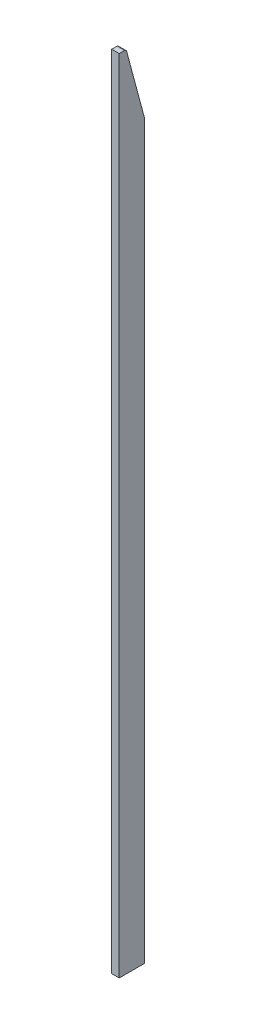
ISO-10303-21;
HEADER;
FILE_DESCRIPTION(('STEP AP214'),'2;1');
FILE_NAME('part.step','',(''),(''),'','','');
FILE_SCHEMA(('AUTOMOTIVE_DESIGN { 1 0 10303 214 1 1 1 1 }'));
ENDSEC;
DATA;
#1=APPLICATION_CONTEXT('core data for automotive mechanical design processes');
#2=APPLICATION_PROTOCOL_DEFINITION('international standard','automotive_design',2000,#1);
#3=PRODUCT_CONTEXT('',#1,'mechanical');
#4=PRODUCT('Part','Part','',(#3));
#5=PRODUCT_RELATED_PRODUCT_CATEGORY('part','',(#4));
#6=PRODUCT_DEFINITION_FORMATION('','',#4);
#7=PRODUCT_DEFINITION_CONTEXT('part definition',#1,'design');
#8=PRODUCT_DEFINITION('design','',#6,#7);
#9=PRODUCT_DEFINITION_SHAPE('','',#8);
#10=(LENGTH_UNIT() NAMED_UNIT(*) SI_UNIT(.MILLI.,.METRE.));
#11=(NAMED_UNIT(*) PLANE_ANGLE_UNIT() SI_UNIT($,.RADIAN.));
#12=(NAMED_UNIT(*) SI_UNIT($,.STERADIAN.) SOLID_ANGLE_UNIT());
#13=UNCERTAINTY_MEASURE_WITH_UNIT(LENGTH_MEASURE(1.E-05),#10,'distance_accuracy_value','');
#14=(GEOMETRIC_REPRESENTATION_CONTEXT(3) GLOBAL_UNCERTAINTY_ASSIGNED_CONTEXT((#13)) GLOBAL_UNIT_ASSIGNED_CONTEXT((#10,
#11,#12)) REPRESENTATION_CONTEXT('',''));
#15=CARTESIAN_POINT('',(0.,0.,0.));
#16=DIRECTION('',(0.,0.,1.));
#17=DIRECTION('',(1.,0.,0.));
#18=AXIS2_PLACEMENT_3D('',#15,#16,#17);
#19=CARTESIAN_POINT('',(9.525,0.,0.));
#20=DIRECTION('',(1.,0.,0.));
#21=DIRECTION('',(0.,0.,-1.));
#22=AXIS2_PLACEMENT_3D('',#19,#20,#21);
#23=PLANE('',#22);
#24=DIRECTION('',(0.,1.,0.));
#25=VECTOR('',#24,1.);
#26=CARTESIAN_POINT('',(9.525,0.,-15.875));
#27=LINE('',#26,#25);
#28=CARTESIAN_POINT('',(9.525,930.29816748173,-15.8749999999885));
#29=VERTEX_POINT('',#28);
#30=CARTESIAN_POINT('',(9.525,0.,-15.875));
#31=VERTEX_POINT('',#30);
#32=EDGE_CURVE('E77',#29,#31,#27,.F.);
#33=ORIENTED_EDGE('',*,*,#32,.F.);
#34=DIRECTION('',(0.,-0.965925826289076,-0.258819045102493));
#35=VECTOR('',#34,1.);
#36=CARTESIAN_POINT('',(9.525,1013.64675046826,6.45818550153306));
#37=LINE('',#36,#35);
#38=CARTESIAN_POINT('',(9.525,1013.64675046823,6.45818550153244));
#39=VERTEX_POINT('',#38);
#40=EDGE_CURVE('E115',#29,#39,#37,.F.);
#41=ORIENTED_EDGE('',*,*,#40,.T.);
#42=CARTESIAN_POINT('',(9.525,1012.825,9.525));
#43=DIRECTION('',(1.,0.,0.));
#44=DIRECTION('',(0.,0.,-1.));
#45=AXIS2_PLACEMENT_3D('',#42,#43,#44);
#46=CIRCLE('',#45,3.175);
#47=CARTESIAN_POINT('',(9.525,1016.,9.525));
#48=VERTEX_POINT('',#47);
#49=EDGE_CURVE('E36',#48,#39,#46,.F.);
#50=ORIENTED_EDGE('',*,*,#49,.F.);
#51=DIRECTION('',(0.,0.,1.));
#52=VECTOR('',#51,1.);
#53=CARTESIAN_POINT('',(9.525,1016.,-15.875));
#54=LINE('',#53,#52);
#55=CARTESIAN_POINT('',(9.525,1016.,15.875));
#56=VERTEX_POINT('',#55);
#57=EDGE_CURVE('E68',#56,#48,#54,.F.);
#58=ORIENTED_EDGE('',*,*,#57,.F.);
#59=DIRECTION('',(0.,1.,0.));
#60=VECTOR('',#59,1.);
#61=CARTESIAN_POINT('',(9.525,1016.,15.875));
#62=LINE('',#61,#60);
#63=CARTESIAN_POINT('',(9.525,0.,15.875));
#64=VERTEX_POINT('',#63);
#65=EDGE_CURVE('E95',#64,#56,#62,.T.);
#66=ORIENTED_EDGE('',*,*,#65,.F.);
#67=DIRECTION('',(0.,0.,-1.));
#68=VECTOR('',#67,1.);
#69=CARTESIAN_POINT('',(9.525,0.,15.875));
#70=LINE('',#69,#68);
#71=EDGE_CURVE('E90',#31,#64,#70,.F.);
#72=ORIENTED_EDGE('',*,*,#71,.F.);
#73=EDGE_LOOP('',(#33,#41,#50,#58,#66,#72));
#74=FACE_BOUND('',#73,.T.);
#75=ADVANCED_FACE('F33',(#74),#23,.T.);
#76=CARTESIAN_POINT('',(0.,1016.,-15.875));
#77=DIRECTION('',(0.,1.,0.));
#78=DIRECTION('',(0.,0.,1.));
#79=AXIS2_PLACEMENT_3D('',#76,#77,#78);
#80=PLANE('',#79);
#81=DIRECTION('',(1.,0.,0.));
#82=VECTOR('',#81,1.);
#83=CARTESIAN_POINT('',(0.,1016.,15.875));
#84=LINE('',#83,#82);
#85=CARTESIAN_POINT('',(0.,1016.,15.875));
#86=VERTEX_POINT('',#85);
#87=EDGE_CURVE('E98',#56,#86,#84,.F.);
#88=ORIENTED_EDGE('',*,*,#87,.F.);
#89=ORIENTED_EDGE('',*,*,#57,.T.);
#90=DIRECTION('',(1.,0.,0.));
#91=VECTOR('',#90,1.);
#92=CARTESIAN_POINT('',(9.525,1016.,9.525));
#93=LINE('',#92,#91);
#94=CARTESIAN_POINT('',(0.,1016.,9.525));
#95=VERTEX_POINT('',#94);
#96=EDGE_CURVE('E117',#95,#48,#93,.T.);
#97=ORIENTED_EDGE('',*,*,#96,.F.);
#98=DIRECTION('',(0.,0.,-1.));
#99=VECTOR('',#98,1.);
#100=CARTESIAN_POINT('',(0.,1016.,0.));
#101=LINE('',#100,#99);
#102=EDGE_CURVE('E106',#95,#86,#101,.F.);
#103=ORIENTED_EDGE('',*,*,#102,.T.);
#104=EDGE_LOOP('',(#88,#89,#97,#103));
#105=FACE_BOUND('',#104,.T.);
#106=ADVANCED_FACE('F105',(#105),#80,.T.);
#107=CARTESIAN_POINT('',(0.,1016.,15.875));
#108=DIRECTION('',(0.,0.,1.));
#109=DIRECTION('',(1.,0.,0.));
#110=AXIS2_PLACEMENT_3D('',#107,#108,#109);
#111=PLANE('',#110);
#112=ORIENTED_EDGE('',*,*,#65,.T.);
#113=ORIENTED_EDGE('',*,*,#87,.T.);
#114=DIRECTION('',(0.,1.,0.));
#115=VECTOR('',#114,1.);
#116=CARTESIAN_POINT('',(0.,0.,15.875));
#117=LINE('',#116,#115);
#118=CARTESIAN_POINT('',(0.,0.,15.875));
#119=VERTEX_POINT('',#118);
#120=EDGE_CURVE('E142',#86,#119,#117,.F.);
#121=ORIENTED_EDGE('',*,*,#120,.T.);
#122=DIRECTION('',(1.,0.,0.));
#123=VECTOR('',#122,1.);
#124=CARTESIAN_POINT('',(0.,0.,15.875));
#125=LINE('',#124,#123);
#126=EDGE_CURVE('E100',#64,#119,#125,.F.);
#127=ORIENTED_EDGE('',*,*,#126,.F.);
#128=EDGE_LOOP('',(#112,#113,#121,#127));
#129=FACE_BOUND('',#128,.T.);
#130=ADVANCED_FACE('F96',(#129),#111,.T.);
#131=CARTESIAN_POINT('',(0.,0.,15.875));
#132=DIRECTION('',(0.,-1.,0.));
#133=DIRECTION('',(0.,0.,-1.));
#134=AXIS2_PLACEMENT_3D('',#131,#132,#133);
#135=PLANE('',#134);
#136=ORIENTED_EDGE('',*,*,#71,.T.);
#137=ORIENTED_EDGE('',*,*,#126,.T.);
#138=DIRECTION('',(0.,0.,-1.));
#139=VECTOR('',#138,1.);
#140=CARTESIAN_POINT('',(0.,0.,0.));
#141=LINE('',#140,#139);
#142=CARTESIAN_POINT('',(0.,0.,-15.875));
#143=VERTEX_POINT('',#142);
#144=EDGE_CURVE('E143',#119,#143,#141,.T.);
#145=ORIENTED_EDGE('',*,*,#144,.T.);
#146=DIRECTION('',(-1.,0.,0.));
#147=VECTOR('',#146,1.);
#148=CARTESIAN_POINT('',(0.,0.,-15.875));
#149=LINE('',#148,#147);
#150=EDGE_CURVE('E124',#31,#143,#149,.T.);
#151=ORIENTED_EDGE('',*,*,#150,.F.);
#152=EDGE_LOOP('',(#136,#137,#145,#151));
#153=FACE_BOUND('',#152,.T.);
#154=ADVANCED_FACE('F172',(#153),#135,.T.);
#155=CARTESIAN_POINT('',(0.,0.,-15.875));
#156=DIRECTION('',(0.,0.,-1.));
#157=DIRECTION('',(-1.,0.,0.));
#158=AXIS2_PLACEMENT_3D('',#155,#156,#157);
#159=PLANE('',#158);
#160=ORIENTED_EDGE('',*,*,#150,.T.);
#161=DIRECTION('',(0.,1.,0.));
#162=VECTOR('',#161,1.);
#163=CARTESIAN_POINT('',(0.,0.,-15.875));
#164=LINE('',#163,#162);
#165=CARTESIAN_POINT('',(0.,930.298167481718,-15.8749999999943));
#166=VERTEX_POINT('',#165);
#167=EDGE_CURVE('E144',#143,#166,#164,.T.);
#168=ORIENTED_EDGE('',*,*,#167,.T.);
#169=DIRECTION('',(1.,0.,0.));
#170=VECTOR('',#169,1.);
#171=CARTESIAN_POINT('',(9.525,930.298167481729,-15.8749999999828));
#172=LINE('',#171,#170);
#173=EDGE_CURVE('E118',#166,#29,#172,.T.);
#174=ORIENTED_EDGE('',*,*,#173,.T.);
#175=ORIENTED_EDGE('',*,*,#32,.T.);
#176=EDGE_LOOP('',(#160,#168,#174,#175));
#177=FACE_BOUND('',#176,.T.);
#178=ADVANCED_FACE('F170',(#177),#159,.T.);
#179=CARTESIAN_POINT('',(9.525,1013.64675046826,6.45818550153306));
#180=DIRECTION('',(0.,-0.258819045102493,0.965925826289076));
#181=DIRECTION('',(0.,-0.965925826289076,-0.258819045102493));
#182=AXIS2_PLACEMENT_3D('',#179,#180,#181);
#183=PLANE('',#182);
#184=DIRECTION('',(1.,0.,0.));
#185=VECTOR('',#184,1.);
#186=CARTESIAN_POINT('',(9.525,1013.64675046825,6.45818550154581));
#187=LINE('',#186,#185);
#188=CARTESIAN_POINT('',(0.,1013.64675046823,6.45818550152412));
#189=VERTEX_POINT('',#188);
#190=EDGE_CURVE('E49',#39,#189,#187,.F.);
#191=ORIENTED_EDGE('',*,*,#190,.F.);
#192=ORIENTED_EDGE('',*,*,#40,.F.);
#193=ORIENTED_EDGE('',*,*,#173,.F.);
#194=DIRECTION('',(0.,0.96592582628909,0.258819045102442));
#195=VECTOR('',#194,1.);
#196=CARTESIAN_POINT('',(0.,930.298167481732,-15.8749999999949));
#197=LINE('',#196,#195);
#198=EDGE_CURVE('E42',#166,#189,#197,.T.);
#199=ORIENTED_EDGE('',*,*,#198,.T.);
#200=EDGE_LOOP('',(#191,#192,#193,#199));
#201=FACE_BOUND('',#200,.T.);
#202=ADVANCED_FACE('F166',(#201),#183,.F.);
#203=CARTESIAN_POINT('',(9.525,1012.825,9.525));
#204=DIRECTION('',(1.,0.,0.));
#205=DIRECTION('',(0.,0.,-1.));
#206=AXIS2_PLACEMENT_3D('',#203,#204,#205);
#207=CYLINDRICAL_SURFACE('',#206,3.175);
#208=ORIENTED_EDGE('',*,*,#49,.T.);
#209=ORIENTED_EDGE('',*,*,#190,.T.);
#210=CARTESIAN_POINT('',(0.,1012.825,9.525));
#211=DIRECTION('',(1.,0.,0.));
#212=DIRECTION('',(0.,0.,-1.));
#213=AXIS2_PLACEMENT_3D('',#210,#211,#212);
#214=CIRCLE('',#213,3.175);
#215=EDGE_CURVE('E11',#189,#95,#214,.T.);
#216=ORIENTED_EDGE('',*,*,#215,.T.);
#217=ORIENTED_EDGE('',*,*,#96,.T.);
#218=EDGE_LOOP('',(#208,#209,#216,#217));
#219=FACE_BOUND('',#218,.T.);
#220=ADVANCED_FACE('F169',(#219),#207,.T.);
#221=CARTESIAN_POINT('',(0.,0.,0.));
#222=DIRECTION('',(1.,0.,0.));
#223=DIRECTION('',(0.,0.,-1.));
#224=AXIS2_PLACEMENT_3D('',#221,#222,#223);
#225=PLANE('',#224);
#226=ORIENTED_EDGE('',*,*,#198,.F.);
#227=ORIENTED_EDGE('',*,*,#167,.F.);
#228=ORIENTED_EDGE('',*,*,#144,.F.);
#229=ORIENTED_EDGE('',*,*,#120,.F.);
#230=ORIENTED_EDGE('',*,*,#102,.F.);
#231=ORIENTED_EDGE('',*,*,#215,.F.);
#232=EDGE_LOOP('',(#226,#227,#228,#229,#230,#231));
#233=FACE_BOUND('',#232,.T.);
#234=ADVANCED_FACE('F168',(#233),#225,.F.);
#235=CLOSED_SHELL('',(#75,#106,#130,#154,#178,#202,#220,#234));
#236=MANIFOLD_SOLID_BREP('B2',#235);
#237=ADVANCED_BREP_SHAPE_REPRESENTATION('',(#18,#236),#14);
#238=SHAPE_DEFINITION_REPRESENTATION(#9,#237);
ENDSEC;
END-ISO-10303-21;
